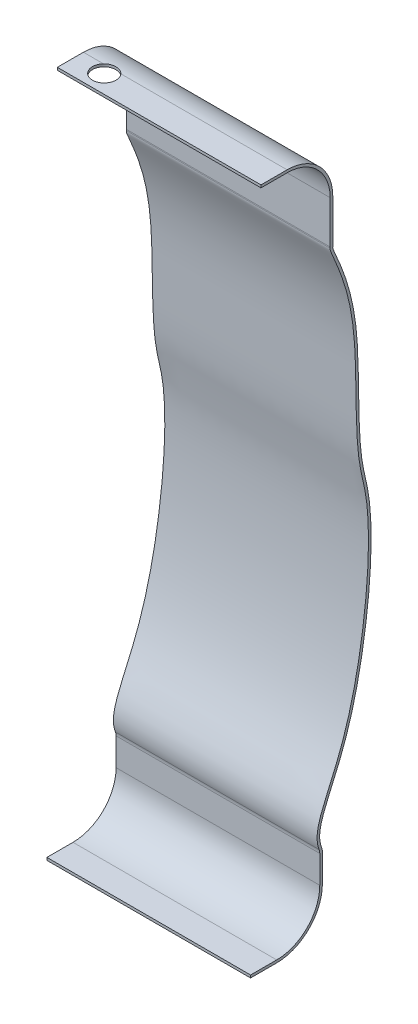
ISO-10303-21;
HEADER;
FILE_DESCRIPTION(('STEP AP214'),'2;1');
FILE_NAME('part.step','',(''),(''),'','','');
FILE_SCHEMA(('AUTOMOTIVE_DESIGN { 1 0 10303 214 1 1 1 1 }'));
ENDSEC;
DATA;
#1=APPLICATION_CONTEXT('core data for automotive mechanical design processes');
#2=APPLICATION_PROTOCOL_DEFINITION('international standard','automotive_design',2000,#1);
#3=PRODUCT_CONTEXT('',#1,'mechanical');
#4=PRODUCT('Part','Part','',(#3));
#5=PRODUCT_RELATED_PRODUCT_CATEGORY('part','',(#4));
#6=PRODUCT_DEFINITION_FORMATION('','',#4);
#7=PRODUCT_DEFINITION_CONTEXT('part definition',#1,'design');
#8=PRODUCT_DEFINITION('design','',#6,#7);
#9=PRODUCT_DEFINITION_SHAPE('','',#8);
#10=(LENGTH_UNIT() NAMED_UNIT(*) SI_UNIT(.MILLI.,.METRE.));
#11=(NAMED_UNIT(*) PLANE_ANGLE_UNIT() SI_UNIT($,.RADIAN.));
#12=(NAMED_UNIT(*) SI_UNIT($,.STERADIAN.) SOLID_ANGLE_UNIT());
#13=UNCERTAINTY_MEASURE_WITH_UNIT(LENGTH_MEASURE(1.E-05),#10,'distance_accuracy_value','');
#14=(GEOMETRIC_REPRESENTATION_CONTEXT(3) GLOBAL_UNCERTAINTY_ASSIGNED_CONTEXT((#13)) GLOBAL_UNIT_ASSIGNED_CONTEXT((#10,
#11,#12)) REPRESENTATION_CONTEXT('',''));
#15=CARTESIAN_POINT('',(0.,0.,0.));
#16=DIRECTION('',(0.,0.,1.));
#17=DIRECTION('',(1.,0.,0.));
#18=AXIS2_PLACEMENT_3D('',#15,#16,#17);
#19=CARTESIAN_POINT('',(15.6,52.21,-0.797662791309079));
#20=DIRECTION('',(0.,0.,-1.));
#21=DIRECTION('',(-1.,0.,0.));
#22=AXIS2_PLACEMENT_3D('',#19,#20,#21);
#23=PLANE('',#22);
#24=DIRECTION('',(0.,-1.,0.));
#25=VECTOR('',#24,1.);
#26=CARTESIAN_POINT('',(0.,52.21,-0.797662791309079));
#27=LINE('',#26,#25);
#28=CARTESIAN_POINT('',(0.,52.21,-0.797662791309079));
#29=VERTEX_POINT('',#28);
#30=CARTESIAN_POINT('',(0.,52.01,-0.797662791309079));
#31=VERTEX_POINT('',#30);
#32=EDGE_CURVE('E192',#29,#31,#27,.T.);
#33=ORIENTED_EDGE('',*,*,#32,.T.);
#34=DIRECTION('',(-1.,0.,0.));
#35=VECTOR('',#34,1.);
#36=CARTESIAN_POINT('',(15.6,52.01,-0.797662791309079));
#37=LINE('',#36,#35);
#38=CARTESIAN_POINT('',(15.6,52.01,-0.797662791309079));
#39=VERTEX_POINT('',#38);
#40=EDGE_CURVE('E49',#39,#31,#37,.T.);
#41=ORIENTED_EDGE('',*,*,#40,.F.);
#42=DIRECTION('',(0.,-1.,0.));
#43=VECTOR('',#42,1.);
#44=CARTESIAN_POINT('',(15.6,52.21,-0.797662791309079));
#45=LINE('',#44,#43);
#46=CARTESIAN_POINT('',(15.6,52.21,-0.797662791309079));
#47=VERTEX_POINT('',#46);
#48=EDGE_CURVE('E328',#47,#39,#45,.T.);
#49=ORIENTED_EDGE('',*,*,#48,.F.);
#50=DIRECTION('',(-1.,0.,0.));
#51=VECTOR('',#50,1.);
#52=CARTESIAN_POINT('',(15.6,52.21,-0.797662791309079));
#53=LINE('',#52,#51);
#54=EDGE_CURVE('E206',#47,#29,#53,.T.);
#55=ORIENTED_EDGE('',*,*,#54,.T.);
#56=EDGE_LOOP('',(#33,#41,#49,#55));
#57=FACE_BOUND('',#56,.T.);
#58=ADVANCED_FACE('F37',(#57),#23,.F.);
#59=CARTESIAN_POINT('',(15.6,52.01,-0.797662791309079));
#60=DIRECTION('',(0.,1.,0.));
#61=DIRECTION('',(0.,0.,1.));
#62=AXIS2_PLACEMENT_3D('',#59,#60,#61);
#63=PLANE('',#62);
#64=DIRECTION('',(-1.,0.,0.));
#65=VECTOR('',#64,1.);
#66=CARTESIAN_POINT('',(15.6,52.01,-2.79766279130905));
#67=LINE('',#66,#65);
#68=CARTESIAN_POINT('',(1.53652251454682,52.01,-2.79766279130905));
#69=VERTEX_POINT('',#68);
#70=CARTESIAN_POINT('',(0.,52.01,-2.79766279130905));
#71=VERTEX_POINT('',#70);
#72=EDGE_CURVE('E260',#69,#71,#67,.T.);
#73=ORIENTED_EDGE('',*,*,#72,.F.);
#74=CARTESIAN_POINT('',(2.20093170969449,52.01,-2.1905710178487));
#75=DIRECTION('',(0.,1.,0.));
#76=DIRECTION('',(0.,0.,1.));
#77=AXIS2_PLACEMENT_3D('',#74,#75,#76);
#78=CIRCLE('',#77,0.9);
#79=CARTESIAN_POINT('',(2.86534090484215,52.01,-2.79766279130905));
#80=VERTEX_POINT('',#79);
#81=EDGE_CURVE('E62',#69,#80,#78,.T.);
#82=ORIENTED_EDGE('',*,*,#81,.T.);
#83=CARTESIAN_POINT('',(15.6,52.01,-2.79766279130905));
#84=VERTEX_POINT('',#83);
#85=EDGE_CURVE('E261',#84,#80,#67,.T.);
#86=ORIENTED_EDGE('',*,*,#85,.F.);
#87=DIRECTION('',(0.,0.,-1.));
#88=VECTOR('',#87,1.);
#89=CARTESIAN_POINT('',(15.6,52.01,-0.797662791309079));
#90=LINE('',#89,#88);
#91=EDGE_CURVE('E273',#39,#84,#90,.T.);
#92=ORIENTED_EDGE('',*,*,#91,.F.);
#93=ORIENTED_EDGE('',*,*,#40,.T.);
#94=DIRECTION('',(0.,0.,-1.));
#95=VECTOR('',#94,1.);
#96=CARTESIAN_POINT('',(0.,52.01,-0.797662791309079));
#97=LINE('',#96,#95);
#98=EDGE_CURVE('E270',#31,#71,#97,.T.);
#99=ORIENTED_EDGE('',*,*,#98,.T.);
#100=EDGE_LOOP('',(#73,#82,#86,#92,#93,#99));
#101=FACE_BOUND('',#100,.T.);
#102=ADVANCED_FACE('F269',(#101),#63,.F.);
#103=CARTESIAN_POINT('',(15.6,48.71,-2.79766279130905));
#104=DIRECTION('',(-1.,0.,0.));
#105=DIRECTION('',(0.,0.,1.));
#106=AXIS2_PLACEMENT_3D('',#103,#104,#105);
#107=CYLINDRICAL_SURFACE('',#106,3.3);
#108=ORIENTED_EDGE('',*,*,#85,.T.);
#109=CARTESIAN_POINT('',(2.86534090484215,52.01,-2.79766279130905));
#110=CARTESIAN_POINT('',(2.83125262608083,52.0099950765936,-2.83503150673299));
#111=CARTESIAN_POINT('',(2.79397210331333,52.0093638458642,-2.86945221485938));
#112=CARTESIAN_POINT('',(2.71422797964797,52.0074304321461,-2.93155573770363));
#113=CARTESIAN_POINT('',(2.67176861601361,52.0061287949026,-2.95924400602279));
#114=CARTESIAN_POINT('',(2.58279534583216,52.0034339209938,-3.00711151326022));
#115=CARTESIAN_POINT('',(2.53628019799037,52.0020406563178,-3.02728844326601));
#116=CARTESIAN_POINT('',(2.44052467787826,51.9996310902168,-3.05956233725572));
#117=CARTESIAN_POINT('',(2.39128472689128,51.9986147307045,-3.07166054653652));
#118=CARTESIAN_POINT('',(2.29140700306978,51.9972622534174,-3.08743971806711));
#119=CARTESIAN_POINT('',(2.24076772748923,51.9969268982329,-3.0911112446963));
#120=CARTESIAN_POINT('',(2.1395902325073,51.9970345854965,-3.08990231841957));
#121=CARTESIAN_POINT('',(2.08905201667008,51.9974776549294,-3.08502156903995));
#122=CARTESIAN_POINT('',(1.98969159724615,51.9990124295294,-3.06688121259066));
#123=CARTESIAN_POINT('',(1.94086418648515,52.0001019446289,-3.05364988651291));
#124=CARTESIAN_POINT('',(1.84611336286375,52.0025995731614,-3.01921179700735));
#125=CARTESIAN_POINT('',(1.80018996055565,52.004007687752,-2.99800500460098));
#126=CARTESIAN_POINT('',(1.71545103251504,52.0065703466854,-2.94986017713211));
#127=CARTESIAN_POINT('',(1.67636612980037,52.0077355124315,-2.92339525646558));
#128=CARTESIAN_POINT('',(1.60277501931088,52.0094489592646,-2.86469194922545));
#129=CARTESIAN_POINT('',(1.56826998637905,52.0099970823347,-2.83245208620909));
#130=CARTESIAN_POINT('',(1.53652251454682,52.01,-2.79766279130905));
#131=B_SPLINE_CURVE_WITH_KNOTS('',3,(#109,#110,#111,#112,#113,#114,#115,#116,#117,#118,#119,
#120,#121,#122,#123,#124,#125,#126,#127,#128,#129,#130),.UNSPECIFIED.,.F.,.F.,(4,2,2,2,2,2,2,2,
2,2,4),(0.,0.151524297772248,0.302925441552756,0.454373086222092,0.605797380555743,
0.757391146868687,0.908990168443901,1.0600785029621,1.21116738645936,1.35224058869955,
1.49334990984048),.UNSPECIFIED.);
#132=EDGE_CURVE('E11',#80,#69,#131,.T.);
#133=ORIENTED_EDGE('',*,*,#132,.T.);
#134=ORIENTED_EDGE('',*,*,#72,.T.);
#135=CARTESIAN_POINT('',(0.,48.71,-2.79766279130905));
#136=DIRECTION('',(-1.,0.,0.));
#137=DIRECTION('',(0.,0.,1.));
#138=AXIS2_PLACEMENT_3D('',#135,#136,#137);
#139=CIRCLE('',#138,3.3);
#140=CARTESIAN_POINT('',(0.,48.71,-6.09766279130905));
#141=VERTEX_POINT('',#140);
#142=EDGE_CURVE('E281',#71,#141,#139,.T.);
#143=ORIENTED_EDGE('',*,*,#142,.T.);
#144=DIRECTION('',(-1.,0.,0.));
#145=VECTOR('',#144,1.);
#146=CARTESIAN_POINT('',(15.6,48.71,-6.09766279130905));
#147=LINE('',#146,#145);
#148=CARTESIAN_POINT('',(15.6,48.71,-6.09766279130905));
#149=VERTEX_POINT('',#148);
#150=EDGE_CURVE('E257',#149,#141,#147,.T.);
#151=ORIENTED_EDGE('',*,*,#150,.F.);
#152=CARTESIAN_POINT('',(15.6,48.71,-2.79766279130905));
#153=DIRECTION('',(-1.,0.,0.));
#154=DIRECTION('',(0.,0.,1.));
#155=AXIS2_PLACEMENT_3D('',#152,#153,#154);
#156=CIRCLE('',#155,3.3);
#157=EDGE_CURVE('E331',#84,#149,#156,.T.);
#158=ORIENTED_EDGE('',*,*,#157,.F.);
#159=EDGE_LOOP('',(#108,#133,#134,#143,#151,#158));
#160=FACE_BOUND('',#159,.T.);
#161=ADVANCED_FACE('F368',(#160),#107,.F.);
#162=CARTESIAN_POINT('',(15.6,48.71,-6.09766279130905));
#163=DIRECTION('',(0.,0.,-1.));
#164=DIRECTION('',(0.,1.,0.));
#165=AXIS2_PLACEMENT_3D('',#162,#163,#164);
#166=PLANE('',#165);
#167=DIRECTION('',(0.,-1.,0.));
#168=VECTOR('',#167,1.);
#169=CARTESIAN_POINT('',(0.,48.71,-6.09766279130905));
#170=LINE('',#169,#168);
#171=CARTESIAN_POINT('',(0.,45.4405241872609,-6.09766279130905));
#172=VERTEX_POINT('',#171);
#173=EDGE_CURVE('E287',#141,#172,#170,.T.);
#174=ORIENTED_EDGE('',*,*,#173,.T.);
#175=DIRECTION('',(-1.,0.,0.));
#176=VECTOR('',#175,1.);
#177=CARTESIAN_POINT('',(15.6,45.4405241872609,-6.09766279130905));
#178=LINE('',#177,#176);
#179=CARTESIAN_POINT('',(15.6,45.4405241872609,-6.09766279130905));
#180=VERTEX_POINT('',#179);
#181=EDGE_CURVE('E254',#180,#172,#178,.T.);
#182=ORIENTED_EDGE('',*,*,#181,.F.);
#183=DIRECTION('',(0.,-1.,0.));
#184=VECTOR('',#183,1.);
#185=CARTESIAN_POINT('',(15.6,48.71,-6.09766279130905));
#186=LINE('',#185,#184);
#187=EDGE_CURVE('E340',#149,#180,#186,.T.);
#188=ORIENTED_EDGE('',*,*,#187,.F.);
#189=ORIENTED_EDGE('',*,*,#150,.T.);
#190=EDGE_LOOP('',(#174,#182,#188,#189));
#191=FACE_BOUND('',#190,.T.);
#192=ADVANCED_FACE('F365',(#191),#166,.F.);
#193=CARTESIAN_POINT('',(15.6,45.4405241872609,-5.29766279130905));
#194=DIRECTION('',(-1.,0.,0.));
#195=DIRECTION('',(0.,0.,1.));
#196=AXIS2_PLACEMENT_3D('',#193,#194,#195);
#197=CYLINDRICAL_SURFACE('',#196,0.8);
#198=CARTESIAN_POINT('',(0.,45.4405241872609,-5.29766279130905));
#199=DIRECTION('',(-1.,0.,0.));
#200=DIRECTION('',(0.,0.,1.));
#201=AXIS2_PLACEMENT_3D('',#198,#199,#200);
#202=CIRCLE('',#201,0.8);
#203=CARTESIAN_POINT('',(0.,45.3611419140997,-6.09371458278229));
#204=VERTEX_POINT('',#203);
#205=EDGE_CURVE('E289',#172,#204,#202,.T.);
#206=ORIENTED_EDGE('',*,*,#205,.T.);
#207=DIRECTION('',(-1.,0.,0.));
#208=VECTOR('',#207,1.);
#209=CARTESIAN_POINT('',(15.6,45.3611419140997,-6.09371458278229));
#210=LINE('',#209,#208);
#211=CARTESIAN_POINT('',(15.6,45.3611419140997,-6.09371458278229));
#212=VERTEX_POINT('',#211);
#213=EDGE_CURVE('E251',#212,#204,#210,.T.);
#214=ORIENTED_EDGE('',*,*,#213,.F.);
#215=CARTESIAN_POINT('',(15.6,45.4405241872609,-5.29766279130905));
#216=DIRECTION('',(-1.,0.,0.));
#217=DIRECTION('',(0.,0.,1.));
#218=AXIS2_PLACEMENT_3D('',#215,#216,#217);
#219=CIRCLE('',#218,0.8);
#220=EDGE_CURVE('E342',#180,#212,#219,.T.);
#221=ORIENTED_EDGE('',*,*,#220,.F.);
#222=ORIENTED_EDGE('',*,*,#181,.T.);
#223=EDGE_LOOP('',(#206,#214,#221,#222));
#224=FACE_BOUND('',#223,.T.);
#225=ADVANCED_FACE('F360',(#224),#197,.F.);
#226=CARTESIAN_POINT('',(15.6,45.3611419140997,-6.09371458278229));
#227=CARTESIAN_POINT('',(15.6,45.2494484681349,-6.08257651396206));
#228=CARTESIAN_POINT('',(15.6,45.0578383023964,-6.15290897803949));
#229=CARTESIAN_POINT('',(15.6,44.6173743254229,-6.33914806295061));
#230=CARTESIAN_POINT('',(15.6,43.986650028269,-6.61619348950636));
#231=CARTESIAN_POINT('',(15.6,42.8956535042626,-7.04556487800436));
#232=CARTESIAN_POINT('',(15.6,41.0742650409865,-7.62154121331735));
#233=CARTESIAN_POINT('',(15.6,38.145708791002,-8.02996995413004));
#234=CARTESIAN_POINT('',(15.6,35.2285125464616,-8.06222946536529));
#235=CARTESIAN_POINT('',(15.6,32.9352796727567,-8.10334710477954));
#236=CARTESIAN_POINT('',(15.6,31.3036408467564,-8.17825231289054));
#237=CARTESIAN_POINT('',(15.6,29.822307078761,-8.3405845822269));
#238=CARTESIAN_POINT('',(15.6,28.5924177483747,-8.63809295163507));
#239=CARTESIAN_POINT('',(15.6,27.3372437401525,-8.89132751248411));
#240=CARTESIAN_POINT('',(15.6,25.8339133345473,-9.01878693222068));
#241=CARTESIAN_POINT('',(15.6,24.1785712860967,-9.0450346855065));
#242=CARTESIAN_POINT('',(15.6,21.822326787492,-8.95220635953251));
#243=CARTESIAN_POINT('',(15.6,18.7363368687496,-8.62342437381633));
#244=CARTESIAN_POINT('',(15.6,15.1954631063846,-7.97121503666978));
#245=CARTESIAN_POINT('',(15.6,12.285584548639,-7.13625115468488));
#246=CARTESIAN_POINT('',(15.6,10.1304173010619,-6.24321833397184));
#247=CARTESIAN_POINT('',(15.6,7.93623449177324,-5.23249018662494));
#248=CARTESIAN_POINT('',(15.6,6.72088456212092,-4.9332230214535));
#249=CARTESIAN_POINT('',(15.6,5.89386005510706,-5.24774959983525));
#250=B_SPLINE_CURVE_WITH_KNOTS('',3,(#226,#227,#228,#229,#230,#231,#232,#233,#234,#235,#236,
#237,#238,#239,#240,#241,#242,#243,#244,#245,#246,#247,#248,#249),.UNSPECIFIED.,.F.,.F.,(4,1,1,
1,1,1,1,1,1,1,1,1,1,1,1,1,1,1,1,1,1,4),(0.006984382045256,0.037839749250481,0.068695116455706,
0.099550483660931,0.130405850866156,0.192116585276606,0.253827319687056,0.315538054097506,
0.346393421302731,0.377248788507956,0.408104155713181,0.438959522918406,0.469814890123631,
0.500670257328856,0.531525624534081,0.562380991739306,0.624091726149756,0.685802460560206,
0.747513194970656,0.809223929381106,0.870934663791556,0.994356132612456),.UNSPECIFIED.);
#251=DIRECTION('',(-1.,0.,0.));
#252=VECTOR('',#251,1.);
#253=SURFACE_OF_LINEAR_EXTRUSION('',#250,#252);
#254=CARTESIAN_POINT('',(0.,45.3611419140997,-6.09371458278229));
#255=CARTESIAN_POINT('',(0.,45.2494484681349,-6.08257651396206));
#256=CARTESIAN_POINT('',(0.,45.0578383023964,-6.15290897803949));
#257=CARTESIAN_POINT('',(0.,44.6173743254229,-6.33914806295061));
#258=CARTESIAN_POINT('',(0.,43.986650028269,-6.61619348950636));
#259=CARTESIAN_POINT('',(0.,42.8956535042626,-7.04556487800436));
#260=CARTESIAN_POINT('',(0.,41.0742650409865,-7.62154121331735));
#261=CARTESIAN_POINT('',(0.,38.145708791002,-8.02996995413004));
#262=CARTESIAN_POINT('',(0.,35.2285125464616,-8.06222946536529));
#263=CARTESIAN_POINT('',(0.,32.9352796727567,-8.10334710477954));
#264=CARTESIAN_POINT('',(0.,31.3036408467564,-8.17825231289054));
#265=CARTESIAN_POINT('',(0.,29.822307078761,-8.3405845822269));
#266=CARTESIAN_POINT('',(0.,28.5924177483747,-8.63809295163507));
#267=CARTESIAN_POINT('',(0.,27.3372437401525,-8.89132751248411));
#268=CARTESIAN_POINT('',(0.,25.8339133345473,-9.01878693222068));
#269=CARTESIAN_POINT('',(0.,24.1785712860967,-9.0450346855065));
#270=CARTESIAN_POINT('',(0.,21.822326787492,-8.95220635953251));
#271=CARTESIAN_POINT('',(0.,18.7363368687496,-8.62342437381633));
#272=CARTESIAN_POINT('',(0.,15.1954631063846,-7.97121503666978));
#273=CARTESIAN_POINT('',(0.,12.285584548639,-7.13625115468488));
#274=CARTESIAN_POINT('',(0.,10.1304173010619,-6.24321833397184));
#275=CARTESIAN_POINT('',(0.,7.93623449177324,-5.23249018662494));
#276=CARTESIAN_POINT('',(0.,6.72088456212092,-4.9332230214535));
#277=CARTESIAN_POINT('',(0.,5.89386005510706,-5.24774959983525));
#278=B_SPLINE_CURVE_WITH_KNOTS('',3,(#254,#255,#256,#257,#258,#259,#260,#261,#262,#263,#264,
#265,#266,#267,#268,#269,#270,#271,#272,#273,#274,#275,#276,#277),.UNSPECIFIED.,.F.,.F.,(4,1,1,
1,1,1,1,1,1,1,1,1,1,1,1,1,1,1,1,1,1,4),(0.006984382045256,0.037839749250481,0.068695116455706,
0.099550483660931,0.130405850866156,0.192116585276606,0.253827319687056,0.315538054097506,
0.346393421302731,0.377248788507956,0.408104155713181,0.438959522918406,0.469814890123631,
0.500670257328856,0.531525624534081,0.562380991739306,0.624091726149756,0.685802460560206,
0.747513194970656,0.809223929381106,0.870934663791556,0.994356132612456),.UNSPECIFIED.);
#279=CARTESIAN_POINT('',(0.,5.89386005510706,-5.24774959983524));
#280=VERTEX_POINT('',#279);
#281=EDGE_CURVE('E291',#204,#280,#278,.T.);
#282=ORIENTED_EDGE('',*,*,#281,.T.);
#283=DIRECTION('',(-1.,0.,0.));
#284=VECTOR('',#283,1.);
#285=CARTESIAN_POINT('',(15.6,5.89386005510706,-5.24774959983524));
#286=LINE('',#285,#284);
#287=CARTESIAN_POINT('',(15.6,5.89386005510706,-5.24774959983524));
#288=VERTEX_POINT('',#287);
#289=EDGE_CURVE('E248',#288,#280,#286,.T.);
#290=ORIENTED_EDGE('',*,*,#289,.F.);
#291=EDGE_CURVE('E344',#212,#288,#250,.T.);
#292=ORIENTED_EDGE('',*,*,#291,.F.);
#293=ORIENTED_EDGE('',*,*,#213,.T.);
#294=EDGE_LOOP('',(#282,#290,#292,#293));
#295=FACE_BOUND('',#294,.T.);
#296=ADVANCED_FACE('F355',(#295),#253,.F.);
#297=CARTESIAN_POINT('',(15.6,5.60948260180559,-4.5));
#298=DIRECTION('',(-1.,0.,0.));
#299=DIRECTION('',(0.,0.,1.));
#300=AXIS2_PLACEMENT_3D('',#297,#298,#299);
#301=CYLINDRICAL_SURFACE('',#300,0.800000000000001);
#302=CARTESIAN_POINT('',(0.,5.60948260180559,-4.5));
#303=DIRECTION('',(-1.,0.,0.));
#304=DIRECTION('',(0.,0.,-1.));
#305=AXIS2_PLACEMENT_3D('',#302,#303,#304);
#306=CIRCLE('',#305,0.800000000000001);
#307=CARTESIAN_POINT('',(0.,5.60948260180559,-5.3));
#308=VERTEX_POINT('',#307);
#309=EDGE_CURVE('E295',#280,#308,#306,.T.);
#310=ORIENTED_EDGE('',*,*,#309,.T.);
#311=DIRECTION('',(-1.,0.,0.));
#312=VECTOR('',#311,1.);
#313=CARTESIAN_POINT('',(15.6,5.60948260180559,-5.3));
#314=LINE('',#313,#312);
#315=CARTESIAN_POINT('',(15.6,5.60948260180559,-5.3));
#316=VERTEX_POINT('',#315);
#317=EDGE_CURVE('E245',#316,#308,#314,.T.);
#318=ORIENTED_EDGE('',*,*,#317,.F.);
#319=CARTESIAN_POINT('',(15.6,5.60948260180559,-4.5));
#320=DIRECTION('',(-1.,0.,0.));
#321=DIRECTION('',(0.,0.,-1.));
#322=AXIS2_PLACEMENT_3D('',#319,#320,#321);
#323=CIRCLE('',#322,0.800000000000001);
#324=EDGE_CURVE('E349',#288,#316,#323,.T.);
#325=ORIENTED_EDGE('',*,*,#324,.F.);
#326=ORIENTED_EDGE('',*,*,#289,.T.);
#327=EDGE_LOOP('',(#310,#318,#325,#326));
#328=FACE_BOUND('',#327,.T.);
#329=ADVANCED_FACE('F359',(#328),#301,.F.);
#330=CARTESIAN_POINT('',(15.6,3.5,-5.3));
#331=DIRECTION('',(0.,0.,-1.));
#332=DIRECTION('',(0.,1.,0.));
#333=AXIS2_PLACEMENT_3D('',#330,#331,#332);
#334=PLANE('',#333);
#335=DIRECTION('',(0.,-1.,0.));
#336=VECTOR('',#335,1.);
#337=CARTESIAN_POINT('',(0.,3.5,-5.3));
#338=LINE('',#337,#336);
#339=CARTESIAN_POINT('',(0.,3.5,-5.3));
#340=VERTEX_POINT('',#339);
#341=EDGE_CURVE('E300',#308,#340,#338,.T.);
#342=ORIENTED_EDGE('',*,*,#341,.T.);
#343=DIRECTION('',(-1.,0.,0.));
#344=VECTOR('',#343,1.);
#345=CARTESIAN_POINT('',(15.6,3.5,-5.3));
#346=LINE('',#345,#344);
#347=CARTESIAN_POINT('',(15.6,3.5,-5.3));
#348=VERTEX_POINT('',#347);
#349=EDGE_CURVE('E242',#348,#340,#346,.T.);
#350=ORIENTED_EDGE('',*,*,#349,.F.);
#351=DIRECTION('',(0.,-1.,0.));
#352=VECTOR('',#351,1.);
#353=CARTESIAN_POINT('',(15.6,3.5,-5.3));
#354=LINE('',#353,#352);
#355=EDGE_CURVE('E628',#316,#348,#354,.T.);
#356=ORIENTED_EDGE('',*,*,#355,.F.);
#357=ORIENTED_EDGE('',*,*,#317,.T.);
#358=EDGE_LOOP('',(#342,#350,#356,#357));
#359=FACE_BOUND('',#358,.T.);
#360=ADVANCED_FACE('F408',(#359),#334,.F.);
#361=CARTESIAN_POINT('',(15.6,3.5,-2.));
#362=DIRECTION('',(-1.,0.,0.));
#363=DIRECTION('',(0.,0.,1.));
#364=AXIS2_PLACEMENT_3D('',#361,#362,#363);
#365=CYLINDRICAL_SURFACE('',#364,3.3);
#366=CARTESIAN_POINT('',(0.,3.5,-2.));
#367=DIRECTION('',(-1.,0.,0.));
#368=DIRECTION('',(0.,0.,1.));
#369=AXIS2_PLACEMENT_3D('',#366,#367,#368);
#370=CIRCLE('',#369,3.3);
#371=CARTESIAN_POINT('',(0.,0.199999999999999,-2.));
#372=VERTEX_POINT('',#371);
#373=EDGE_CURVE('E302',#340,#372,#370,.T.);
#374=ORIENTED_EDGE('',*,*,#373,.T.);
#375=DIRECTION('',(-1.,0.,0.));
#376=VECTOR('',#375,1.);
#377=CARTESIAN_POINT('',(15.6,0.199999999999999,-2.));
#378=LINE('',#377,#376);
#379=CARTESIAN_POINT('',(15.6,0.199999999999999,-2.));
#380=VERTEX_POINT('',#379);
#381=EDGE_CURVE('E239',#380,#372,#378,.T.);
#382=ORIENTED_EDGE('',*,*,#381,.F.);
#383=CARTESIAN_POINT('',(15.6,3.5,-2.));
#384=DIRECTION('',(-1.,0.,0.));
#385=DIRECTION('',(0.,0.,1.));
#386=AXIS2_PLACEMENT_3D('',#383,#384,#385);
#387=CIRCLE('',#386,3.3);
#388=EDGE_CURVE('E626',#348,#380,#387,.T.);
#389=ORIENTED_EDGE('',*,*,#388,.F.);
#390=ORIENTED_EDGE('',*,*,#349,.T.);
#391=EDGE_LOOP('',(#374,#382,#389,#390));
#392=FACE_BOUND('',#391,.T.);
#393=ADVANCED_FACE('F417',(#392),#365,.F.);
#394=CARTESIAN_POINT('',(15.6,0.199999999999999,-2.));
#395=DIRECTION('',(0.,-1.,0.));
#396=DIRECTION('',(0.,0.,-1.));
#397=AXIS2_PLACEMENT_3D('',#394,#395,#396);
#398=PLANE('',#397);
#399=DIRECTION('',(0.,0.,1.));
#400=VECTOR('',#399,1.);
#401=CARTESIAN_POINT('',(0.,0.199999999999999,-2.));
#402=LINE('',#401,#400);
#403=CARTESIAN_POINT('',(0.,0.199999999999999,0.));
#404=VERTEX_POINT('',#403);
#405=EDGE_CURVE('E304',#372,#404,#402,.T.);
#406=ORIENTED_EDGE('',*,*,#405,.T.);
#407=DIRECTION('',(-1.,0.,0.));
#408=VECTOR('',#407,1.);
#409=CARTESIAN_POINT('',(15.6,0.199999999999999,0.));
#410=LINE('',#409,#408);
#411=CARTESIAN_POINT('',(15.6,0.199999999999999,0.));
#412=VERTEX_POINT('',#411);
#413=EDGE_CURVE('E236',#412,#404,#410,.T.);
#414=ORIENTED_EDGE('',*,*,#413,.F.);
#415=DIRECTION('',(0.,0.,1.));
#416=VECTOR('',#415,1.);
#417=CARTESIAN_POINT('',(15.6,0.199999999999999,-2.));
#418=LINE('',#417,#416);
#419=EDGE_CURVE('E619',#380,#412,#418,.T.);
#420=ORIENTED_EDGE('',*,*,#419,.F.);
#421=ORIENTED_EDGE('',*,*,#381,.T.);
#422=EDGE_LOOP('',(#406,#414,#420,#421));
#423=FACE_BOUND('',#422,.T.);
#424=ADVANCED_FACE('F426',(#423),#398,.F.);
#425=CARTESIAN_POINT('',(15.6,0.199999999999999,0.));
#426=DIRECTION('',(0.,0.,-1.));
#427=DIRECTION('',(-1.,0.,0.));
#428=AXIS2_PLACEMENT_3D('',#425,#426,#427);
#429=PLANE('',#428);
#430=DIRECTION('',(0.,-1.,0.));
#431=VECTOR('',#430,1.);
#432=CARTESIAN_POINT('',(0.,0.199999999999999,0.));
#433=LINE('',#432,#431);
#434=CARTESIAN_POINT('',(0.,0.,0.));
#435=VERTEX_POINT('',#434);
#436=EDGE_CURVE('E306',#404,#435,#433,.T.);
#437=ORIENTED_EDGE('',*,*,#436,.T.);
#438=DIRECTION('',(-1.,0.,0.));
#439=VECTOR('',#438,1.);
#440=CARTESIAN_POINT('',(15.6,0.,0.));
#441=LINE('',#440,#439);
#442=CARTESIAN_POINT('',(15.6,0.,0.));
#443=VERTEX_POINT('',#442);
#444=EDGE_CURVE('E233',#443,#435,#441,.T.);
#445=ORIENTED_EDGE('',*,*,#444,.F.);
#446=DIRECTION('',(0.,-1.,0.));
#447=VECTOR('',#446,1.);
#448=CARTESIAN_POINT('',(15.6,0.199999999999999,0.));
#449=LINE('',#448,#447);
#450=EDGE_CURVE('E616',#412,#443,#449,.T.);
#451=ORIENTED_EDGE('',*,*,#450,.F.);
#452=ORIENTED_EDGE('',*,*,#413,.T.);
#453=EDGE_LOOP('',(#437,#445,#451,#452));
#454=FACE_BOUND('',#453,.T.);
#455=ADVANCED_FACE('F436',(#454),#429,.F.);
#456=CARTESIAN_POINT('',(15.6,0.,-2.));
#457=DIRECTION('',(0.,1.,0.));
#458=DIRECTION('',(0.,0.,1.));
#459=AXIS2_PLACEMENT_3D('',#456,#457,#458);
#460=PLANE('',#459);
#461=DIRECTION('',(0.,0.,-1.));
#462=VECTOR('',#461,1.);
#463=CARTESIAN_POINT('',(0.,0.,-2.));
#464=LINE('',#463,#462);
#465=CARTESIAN_POINT('',(0.,0.,-2.));
#466=VERTEX_POINT('',#465);
#467=EDGE_CURVE('E308',#435,#466,#464,.T.);
#468=ORIENTED_EDGE('',*,*,#467,.T.);
#469=DIRECTION('',(-1.,0.,0.));
#470=VECTOR('',#469,1.);
#471=CARTESIAN_POINT('',(15.6,0.,-2.));
#472=LINE('',#471,#470);
#473=CARTESIAN_POINT('',(15.6,0.,-2.));
#474=VERTEX_POINT('',#473);
#475=EDGE_CURVE('E230',#474,#466,#472,.T.);
#476=ORIENTED_EDGE('',*,*,#475,.F.);
#477=DIRECTION('',(0.,0.,-1.));
#478=VECTOR('',#477,1.);
#479=CARTESIAN_POINT('',(15.6,0.,-2.));
#480=LINE('',#479,#478);
#481=EDGE_CURVE('E614',#443,#474,#480,.T.);
#482=ORIENTED_EDGE('',*,*,#481,.F.);
#483=ORIENTED_EDGE('',*,*,#444,.T.);
#484=EDGE_LOOP('',(#468,#476,#482,#483));
#485=FACE_BOUND('',#484,.T.);
#486=ADVANCED_FACE('F446',(#485),#460,.F.);
#487=CARTESIAN_POINT('',(15.6,3.5,-2.));
#488=DIRECTION('',(-1.,0.,0.));
#489=DIRECTION('',(0.,0.,1.));
#490=AXIS2_PLACEMENT_3D('',#487,#488,#489);
#491=CYLINDRICAL_SURFACE('',#490,3.5);
#492=CARTESIAN_POINT('',(0.,3.5,-2.));
#493=DIRECTION('',(1.,0.,0.));
#494=DIRECTION('',(0.,0.,1.));
#495=AXIS2_PLACEMENT_3D('',#492,#493,#494);
#496=CIRCLE('',#495,3.5);
#497=CARTESIAN_POINT('',(0.,3.5,-5.5));
#498=VERTEX_POINT('',#497);
#499=EDGE_CURVE('E310',#466,#498,#496,.T.);
#500=ORIENTED_EDGE('',*,*,#499,.T.);
#501=DIRECTION('',(-1.,0.,0.));
#502=VECTOR('',#501,1.);
#503=CARTESIAN_POINT('',(15.6,3.5,-5.5));
#504=LINE('',#503,#502);
#505=CARTESIAN_POINT('',(15.6,3.5,-5.5));
#506=VERTEX_POINT('',#505);
#507=EDGE_CURVE('E227',#506,#498,#504,.T.);
#508=ORIENTED_EDGE('',*,*,#507,.F.);
#509=CARTESIAN_POINT('',(15.6,3.5,-2.));
#510=DIRECTION('',(1.,0.,0.));
#511=DIRECTION('',(0.,0.,1.));
#512=AXIS2_PLACEMENT_3D('',#509,#510,#511);
#513=CIRCLE('',#512,3.5);
#514=EDGE_CURVE('E607',#474,#506,#513,.T.);
#515=ORIENTED_EDGE('',*,*,#514,.F.);
#516=ORIENTED_EDGE('',*,*,#475,.T.);
#517=EDGE_LOOP('',(#500,#508,#515,#516));
#518=FACE_BOUND('',#517,.T.);
#519=ADVANCED_FACE('F456',(#518),#491,.T.);
#520=CARTESIAN_POINT('',(15.6,3.5,-5.5));
#521=DIRECTION('',(0.,0.,1.));
#522=DIRECTION('',(1.,0.,0.));
#523=AXIS2_PLACEMENT_3D('',#520,#521,#522);
#524=PLANE('',#523);
#525=DIRECTION('',(0.,1.,0.));
#526=VECTOR('',#525,1.);
#527=CARTESIAN_POINT('',(0.,3.5,-5.5));
#528=LINE('',#527,#526);
#529=CARTESIAN_POINT('',(0.,5.60948260180559,-5.5));
#530=VERTEX_POINT('',#529);
#531=EDGE_CURVE('E312',#498,#530,#528,.T.);
#532=ORIENTED_EDGE('',*,*,#531,.T.);
#533=DIRECTION('',(-1.,0.,0.));
#534=VECTOR('',#533,1.);
#535=CARTESIAN_POINT('',(15.6,5.60948260180559,-5.5));
#536=LINE('',#535,#534);
#537=CARTESIAN_POINT('',(15.6,5.60948260180559,-5.5));
#538=VERTEX_POINT('',#537);
#539=EDGE_CURVE('E224',#538,#530,#536,.T.);
#540=ORIENTED_EDGE('',*,*,#539,.F.);
#541=DIRECTION('',(0.,1.,0.));
#542=VECTOR('',#541,1.);
#543=CARTESIAN_POINT('',(15.6,3.5,-5.5));
#544=LINE('',#543,#542);
#545=EDGE_CURVE('E604',#506,#538,#544,.T.);
#546=ORIENTED_EDGE('',*,*,#545,.F.);
#547=ORIENTED_EDGE('',*,*,#507,.T.);
#548=EDGE_LOOP('',(#532,#540,#546,#547));
#549=FACE_BOUND('',#548,.T.);
#550=ADVANCED_FACE('F466',(#549),#524,.F.);
#551=CARTESIAN_POINT('',(15.6,5.60948260180559,-4.5));
#552=DIRECTION('',(-1.,0.,0.));
#553=DIRECTION('',(0.,0.,1.));
#554=AXIS2_PLACEMENT_3D('',#551,#552,#553);
#555=CYLINDRICAL_SURFACE('',#554,1.);
#556=CARTESIAN_POINT('',(0.,5.60948260180559,-4.5));
#557=DIRECTION('',(1.,0.,0.));
#558=DIRECTION('',(0.,0.,-1.));
#559=AXIS2_PLACEMENT_3D('',#556,#557,#558);
#560=CIRCLE('',#559,1.);
#561=CARTESIAN_POINT('',(0.,5.96495441843243,-5.43468699979406));
#562=VERTEX_POINT('',#561);
#563=EDGE_CURVE('E314',#530,#562,#560,.T.);
#564=ORIENTED_EDGE('',*,*,#563,.T.);
#565=DIRECTION('',(-1.,0.,0.));
#566=VECTOR('',#565,1.);
#567=CARTESIAN_POINT('',(15.6,5.96495441843243,-5.43468699979406));
#568=LINE('',#567,#566);
#569=CARTESIAN_POINT('',(15.6,5.96495441843243,-5.43468699979406));
#570=VERTEX_POINT('',#569);
#571=EDGE_CURVE('E221',#570,#562,#568,.T.);
#572=ORIENTED_EDGE('',*,*,#571,.F.);
#573=CARTESIAN_POINT('',(15.6,5.60948260180559,-4.5));
#574=DIRECTION('',(1.,0.,0.));
#575=DIRECTION('',(0.,0.,-1.));
#576=AXIS2_PLACEMENT_3D('',#573,#574,#575);
#577=CIRCLE('',#576,1.);
#578=EDGE_CURVE('E579',#538,#570,#577,.T.);
#579=ORIENTED_EDGE('',*,*,#578,.F.);
#580=ORIENTED_EDGE('',*,*,#539,.T.);
#581=EDGE_LOOP('',(#564,#572,#579,#580));
#582=FACE_BOUND('',#581,.T.);
#583=ADVANCED_FACE('F476',(#582),#555,.T.);
#584=CARTESIAN_POINT('',(15.6,5.96495441843243,-5.43468699979406));
#585=CARTESIAN_POINT('',(15.6,7.65919365826836,-4.79034905509424));
#586=CARTESIAN_POINT('',(15.6,10.8569605651582,-8.06869407027503));
#587=CARTESIAN_POINT('',(15.6,25.3216114207595,-9.79598207917336));
#588=CARTESIAN_POINT('',(15.6,31.3477438973433,-8.05451106304272));
#589=CARTESIAN_POINT('',(15.6,41.1908333808168,-8.74549385749673));
#590=CARTESIAN_POINT('',(15.6,45.0091619276847,-6.25960709126683));
#591=CARTESIAN_POINT('',(15.6,45.3412963458094,-6.2927275306506));
#592=B_SPLINE_CURVE_WITH_KNOTS('',3,(#584,#585,#586,#587,#588,#589,#590,#591),.UNSPECIFIED.,.F.,
.F.,(4,1,1,1,1,4),(0.006984382045256,0.281756511879145,0.543685711902952,0.592452525088993,
0.769424643739557,0.994356132612456),.UNSPECIFIED.);
#593=DIRECTION('',(-1.,0.,0.));
#594=VECTOR('',#593,1.);
#595=SURFACE_OF_LINEAR_EXTRUSION('',#592,#594);
#596=CARTESIAN_POINT('',(0.,5.96495441843243,-5.43468699979406));
#597=CARTESIAN_POINT('',(0.,7.65919365826836,-4.79034905509424));
#598=CARTESIAN_POINT('',(0.,10.8569605651582,-8.06869407027503));
#599=CARTESIAN_POINT('',(0.,25.3216114207595,-9.79598207917336));
#600=CARTESIAN_POINT('',(0.,31.3477438973433,-8.05451106304272));
#601=CARTESIAN_POINT('',(0.,41.1908333808168,-8.74549385749673));
#602=CARTESIAN_POINT('',(0.,45.0091619276847,-6.25960709126683));
#603=CARTESIAN_POINT('',(0.,45.3412963458094,-6.2927275306506));
#604=B_SPLINE_CURVE_WITH_KNOTS('',3,(#596,#597,#598,#599,#600,#601,#602,#603),.UNSPECIFIED.,.F.,
.F.,(4,1,1,1,1,4),(0.006984382045256,0.281756511879145,0.543685711902952,0.592452525088993,
0.769424643739557,0.994356132612456),.UNSPECIFIED.);
#605=CARTESIAN_POINT('',(0.,45.3412963458094,-6.2927275306506));
#606=VERTEX_POINT('',#605);
#607=EDGE_CURVE('E316',#562,#606,#604,.T.);
#608=ORIENTED_EDGE('',*,*,#607,.T.);
#609=DIRECTION('',(-1.,0.,0.));
#610=VECTOR('',#609,1.);
#611=CARTESIAN_POINT('',(15.6,45.3412963458094,-6.2927275306506));
#612=LINE('',#611,#610);
#613=CARTESIAN_POINT('',(15.6,45.3412963458094,-6.2927275306506));
#614=VERTEX_POINT('',#613);
#615=EDGE_CURVE('E218',#614,#606,#612,.T.);
#616=ORIENTED_EDGE('',*,*,#615,.F.);
#617=EDGE_CURVE('E572',#570,#614,#592,.T.);
#618=ORIENTED_EDGE('',*,*,#617,.F.);
#619=ORIENTED_EDGE('',*,*,#571,.T.);
#620=EDGE_LOOP('',(#608,#616,#618,#619));
#621=FACE_BOUND('',#620,.T.);
#622=ADVANCED_FACE('F486',(#621),#595,.F.);
#623=CARTESIAN_POINT('',(15.6,45.4405241872609,-5.29766279130905));
#624=DIRECTION('',(-1.,0.,0.));
#625=DIRECTION('',(0.,0.,1.));
#626=AXIS2_PLACEMENT_3D('',#623,#624,#625);
#627=CYLINDRICAL_SURFACE('',#626,1.);
#628=CARTESIAN_POINT('',(0.,45.4405241872609,-5.29766279130905));
#629=DIRECTION('',(1.,0.,0.));
#630=DIRECTION('',(0.,0.,1.));
#631=AXIS2_PLACEMENT_3D('',#628,#629,#630);
#632=CIRCLE('',#631,1.);
#633=CARTESIAN_POINT('',(0.,45.4405241872609,-6.29766279130905));
#634=VERTEX_POINT('',#633);
#635=EDGE_CURVE('E320',#606,#634,#632,.T.);
#636=ORIENTED_EDGE('',*,*,#635,.T.);
#637=DIRECTION('',(-1.,0.,0.));
#638=VECTOR('',#637,1.);
#639=CARTESIAN_POINT('',(15.6,45.4405241872609,-6.29766279130905));
#640=LINE('',#639,#638);
#641=CARTESIAN_POINT('',(15.6,45.4405241872609,-6.29766279130905));
#642=VERTEX_POINT('',#641);
#643=EDGE_CURVE('E215',#642,#634,#640,.T.);
#644=ORIENTED_EDGE('',*,*,#643,.F.);
#645=CARTESIAN_POINT('',(15.6,45.4405241872609,-5.29766279130905));
#646=DIRECTION('',(1.,0.,0.));
#647=DIRECTION('',(0.,0.,1.));
#648=AXIS2_PLACEMENT_3D('',#645,#646,#647);
#649=CIRCLE('',#648,1.);
#650=EDGE_CURVE('E578',#614,#642,#649,.T.);
#651=ORIENTED_EDGE('',*,*,#650,.F.);
#652=ORIENTED_EDGE('',*,*,#615,.T.);
#653=EDGE_LOOP('',(#636,#644,#651,#652));
#654=FACE_BOUND('',#653,.T.);
#655=ADVANCED_FACE('F496',(#654),#627,.T.);
#656=CARTESIAN_POINT('',(15.6,48.71,-6.29766279130905));
#657=DIRECTION('',(0.,0.,1.));
#658=DIRECTION('',(1.,0.,0.));
#659=AXIS2_PLACEMENT_3D('',#656,#657,#658);
#660=PLANE('',#659);
#661=DIRECTION('',(0.,1.,0.));
#662=VECTOR('',#661,1.);
#663=CARTESIAN_POINT('',(0.,48.71,-6.29766279130905));
#664=LINE('',#663,#662);
#665=CARTESIAN_POINT('',(0.,48.71,-6.29766279130905));
#666=VERTEX_POINT('',#665);
#667=EDGE_CURVE('E325',#634,#666,#664,.T.);
#668=ORIENTED_EDGE('',*,*,#667,.T.);
#669=DIRECTION('',(-1.,0.,0.));
#670=VECTOR('',#669,1.);
#671=CARTESIAN_POINT('',(15.6,48.71,-6.29766279130905));
#672=LINE('',#671,#670);
#673=CARTESIAN_POINT('',(15.6,48.71,-6.29766279130905));
#674=VERTEX_POINT('',#673);
#675=EDGE_CURVE('E208',#674,#666,#672,.T.);
#676=ORIENTED_EDGE('',*,*,#675,.F.);
#677=DIRECTION('',(0.,1.,0.));
#678=VECTOR('',#677,1.);
#679=CARTESIAN_POINT('',(15.6,48.71,-6.29766279130905));
#680=LINE('',#679,#678);
#681=EDGE_CURVE('E585',#642,#674,#680,.T.);
#682=ORIENTED_EDGE('',*,*,#681,.F.);
#683=ORIENTED_EDGE('',*,*,#643,.T.);
#684=EDGE_LOOP('',(#668,#676,#682,#683));
#685=FACE_BOUND('',#684,.T.);
#686=ADVANCED_FACE('F506',(#685),#660,.F.);
#687=CARTESIAN_POINT('',(15.6,48.71,-2.79766279130905));
#688=DIRECTION('',(-1.,0.,0.));
#689=DIRECTION('',(0.,0.,1.));
#690=AXIS2_PLACEMENT_3D('',#687,#688,#689);
#691=CYLINDRICAL_SURFACE('',#690,3.5);
#692=DIRECTION('',(-1.,0.,0.));
#693=VECTOR('',#692,1.);
#694=CARTESIAN_POINT('',(15.6,52.21,-2.79766279130905));
#695=LINE('',#694,#693);
#696=CARTESIAN_POINT('',(1.53652251454682,52.21,-2.79766279130905));
#697=VERTEX_POINT('',#696);
#698=CARTESIAN_POINT('',(0.,52.21,-2.79766279130905));
#699=VERTEX_POINT('',#698);
#700=EDGE_CURVE('E196',#697,#699,#695,.T.);
#701=ORIENTED_EDGE('',*,*,#700,.F.);
#702=CARTESIAN_POINT('',(1.53652251454682,52.21,-2.79766279130905));
#703=CARTESIAN_POINT('',(1.57061463054689,52.2099953654535,-2.83503589173247));
#704=CARTESIAN_POINT('',(1.6079006585284,52.2094000407778,-2.8694609805461));
#705=CARTESIAN_POINT('',(1.68765813638456,52.2075767689952,-2.9315719358286));
#706=CARTESIAN_POINT('',(1.73012534283444,52.20634933697,-2.95926326239377));
#707=CARTESIAN_POINT('',(1.81911655185342,52.20380840417,-3.0071347587838));
#708=CARTESIAN_POINT('',(1.86564187164684,52.2024948754837,-3.02731247848242));
#709=CARTESIAN_POINT('',(1.9614171116798,52.2002236195251,-3.05958448123419));
#710=CARTESIAN_POINT('',(2.01066661837487,52.199265838418,-3.071679987579));
#711=CARTESIAN_POINT('',(2.11055579589123,52.1979918436767,-3.08744985159531));
#712=CARTESIAN_POINT('',(2.16119680576444,52.1976762716399,-3.09111578820081));
#713=CARTESIAN_POINT('',(2.26237689984819,52.1977787292894,-3.08989531592002));
#714=CARTESIAN_POINT('',(2.31291598041748,52.1981967847343,-3.08500860673971));
#715=CARTESIAN_POINT('',(2.41229693834354,52.1996444647538,-3.0668522444054));
#716=CARTESIAN_POINT('',(2.4611434436845,52.2006722547226,-3.05360773112865));
#717=CARTESIAN_POINT('',(2.55592921144145,52.2030281644315,-3.01913638433369));
#718=CARTESIAN_POINT('',(2.60186847121795,52.2043562844442,-2.99790954356848));
#719=CARTESIAN_POINT('',(2.68658040096933,52.2067712089321,-2.94975036665297));
#720=CARTESIAN_POINT('',(2.72562746970277,52.2078682486922,-2.92329955319867));
#721=CARTESIAN_POINT('',(2.79914849391506,52.2094813549175,-2.86463579538425));
#722=CARTESIAN_POINT('',(2.83362133069808,52.2099972794926,-2.83242144597356));
#723=CARTESIAN_POINT('',(2.86534090484215,52.21,-2.79766279130905));
#724=B_SPLINE_CURVE_WITH_KNOTS('',3,(#702,#703,#704,#705,#706,#707,#708,#709,#710,#711,#712,
#713,#714,#715,#716,#717,#718,#719,#720,#721,#722,#723),.UNSPECIFIED.,.F.,.F.,(4,2,2,2,2,2,2,2,
2,2,4),(0.,0.151543617984893,0.302963943426355,0.454433602656495,0.605880330845265,
0.757478287375491,0.90908156680525,1.06023099038001,1.21138055118059,1.35233303743425,
1.4933199324082),.UNSPECIFIED.);
#725=CARTESIAN_POINT('',(2.86534090484215,52.21,-2.79766279130905));
#726=VERTEX_POINT('',#725);
#727=EDGE_CURVE('E186',#697,#726,#724,.T.);
#728=ORIENTED_EDGE('',*,*,#727,.T.);
#729=CARTESIAN_POINT('',(15.6,52.21,-2.79766279130905));
#730=VERTEX_POINT('',#729);
#731=EDGE_CURVE('E199',#730,#726,#695,.T.);
#732=ORIENTED_EDGE('',*,*,#731,.F.);
#733=CARTESIAN_POINT('',(15.6,48.71,-2.79766279130905));
#734=DIRECTION('',(1.,0.,0.));
#735=DIRECTION('',(0.,0.,1.));
#736=AXIS2_PLACEMENT_3D('',#733,#734,#735);
#737=CIRCLE('',#736,3.5);
#738=EDGE_CURVE('E586',#674,#730,#737,.T.);
#739=ORIENTED_EDGE('',*,*,#738,.F.);
#740=ORIENTED_EDGE('',*,*,#675,.T.);
#741=CARTESIAN_POINT('',(0.,48.71,-2.79766279130905));
#742=DIRECTION('',(1.,0.,0.));
#743=DIRECTION('',(0.,0.,1.));
#744=AXIS2_PLACEMENT_3D('',#741,#742,#743);
#745=CIRCLE('',#744,3.5);
#746=EDGE_CURVE('E204',#666,#699,#745,.T.);
#747=ORIENTED_EDGE('',*,*,#746,.T.);
#748=EDGE_LOOP('',(#701,#728,#732,#739,#740,#747));
#749=FACE_BOUND('',#748,.T.);
#750=ADVANCED_FACE('F201',(#749),#691,.T.);
#751=CARTESIAN_POINT('',(15.6,52.21,-0.797662791309079));
#752=DIRECTION('',(0.,-1.,0.));
#753=DIRECTION('',(0.,0.,-1.));
#754=AXIS2_PLACEMENT_3D('',#751,#752,#753);
#755=PLANE('',#754);
#756=ORIENTED_EDGE('',*,*,#731,.T.);
#757=CARTESIAN_POINT('',(2.20093170969449,52.21,-2.1905710178487));
#758=DIRECTION('',(0.,1.,0.));
#759=DIRECTION('',(0.,0.,1.));
#760=AXIS2_PLACEMENT_3D('',#757,#758,#759);
#761=CIRCLE('',#760,0.9);
#762=EDGE_CURVE('E55',#697,#726,#761,.T.);
#763=ORIENTED_EDGE('',*,*,#762,.F.);
#764=ORIENTED_EDGE('',*,*,#700,.T.);
#765=DIRECTION('',(0.,0.,1.));
#766=VECTOR('',#765,1.);
#767=CARTESIAN_POINT('',(0.,52.21,-0.797662791309079));
#768=LINE('',#767,#766);
#769=EDGE_CURVE('E327',#699,#29,#768,.T.);
#770=ORIENTED_EDGE('',*,*,#769,.T.);
#771=ORIENTED_EDGE('',*,*,#54,.F.);
#772=DIRECTION('',(0.,0.,1.));
#773=VECTOR('',#772,1.);
#774=CARTESIAN_POINT('',(15.6,52.21,-0.797662791309079));
#775=LINE('',#774,#773);
#776=EDGE_CURVE('E210',#730,#47,#775,.T.);
#777=ORIENTED_EDGE('',*,*,#776,.F.);
#778=EDGE_LOOP('',(#756,#763,#764,#770,#771,#777));
#779=FACE_BOUND('',#778,.T.);
#780=ADVANCED_FACE('F195',(#779),#755,.F.);
#781=CARTESIAN_POINT('',(15.6,48.71,-2.79766279130905));
#782=DIRECTION('',(-1.,0.,0.));
#783=DIRECTION('',(0.,0.,1.));
#784=AXIS2_PLACEMENT_3D('',#781,#782,#783);
#785=PLANE('',#784);
#786=ORIENTED_EDGE('',*,*,#48,.T.);
#787=ORIENTED_EDGE('',*,*,#91,.T.);
#788=ORIENTED_EDGE('',*,*,#157,.T.);
#789=ORIENTED_EDGE('',*,*,#187,.T.);
#790=ORIENTED_EDGE('',*,*,#220,.T.);
#791=ORIENTED_EDGE('',*,*,#291,.T.);
#792=ORIENTED_EDGE('',*,*,#324,.T.);
#793=ORIENTED_EDGE('',*,*,#355,.T.);
#794=ORIENTED_EDGE('',*,*,#388,.T.);
#795=ORIENTED_EDGE('',*,*,#419,.T.);
#796=ORIENTED_EDGE('',*,*,#450,.T.);
#797=ORIENTED_EDGE('',*,*,#481,.T.);
#798=ORIENTED_EDGE('',*,*,#514,.T.);
#799=ORIENTED_EDGE('',*,*,#545,.T.);
#800=ORIENTED_EDGE('',*,*,#578,.T.);
#801=ORIENTED_EDGE('',*,*,#617,.T.);
#802=ORIENTED_EDGE('',*,*,#650,.T.);
#803=ORIENTED_EDGE('',*,*,#681,.T.);
#804=ORIENTED_EDGE('',*,*,#738,.T.);
#805=ORIENTED_EDGE('',*,*,#776,.T.);
#806=EDGE_LOOP('',(#786,#787,#788,#789,#790,#791,#792,#793,#794,#795,#796,#797,#798,#799,#800,
#801,#802,#803,#804,#805));
#807=FACE_BOUND('',#806,.T.);
#808=ADVANCED_FACE('F523',(#807),#785,.F.);
#809=CARTESIAN_POINT('',(0.,48.71,-2.79766279130905));
#810=DIRECTION('',(-1.,0.,0.));
#811=DIRECTION('',(0.,0.,1.));
#812=AXIS2_PLACEMENT_3D('',#809,#810,#811);
#813=PLANE('',#812);
#814=ORIENTED_EDGE('',*,*,#32,.F.);
#815=ORIENTED_EDGE('',*,*,#769,.F.);
#816=ORIENTED_EDGE('',*,*,#746,.F.);
#817=ORIENTED_EDGE('',*,*,#667,.F.);
#818=ORIENTED_EDGE('',*,*,#635,.F.);
#819=ORIENTED_EDGE('',*,*,#607,.F.);
#820=ORIENTED_EDGE('',*,*,#563,.F.);
#821=ORIENTED_EDGE('',*,*,#531,.F.);
#822=ORIENTED_EDGE('',*,*,#499,.F.);
#823=ORIENTED_EDGE('',*,*,#467,.F.);
#824=ORIENTED_EDGE('',*,*,#436,.F.);
#825=ORIENTED_EDGE('',*,*,#405,.F.);
#826=ORIENTED_EDGE('',*,*,#373,.F.);
#827=ORIENTED_EDGE('',*,*,#341,.F.);
#828=ORIENTED_EDGE('',*,*,#309,.F.);
#829=ORIENTED_EDGE('',*,*,#281,.F.);
#830=ORIENTED_EDGE('',*,*,#205,.F.);
#831=ORIENTED_EDGE('',*,*,#173,.F.);
#832=ORIENTED_EDGE('',*,*,#142,.F.);
#833=ORIENTED_EDGE('',*,*,#98,.F.);
#834=EDGE_LOOP('',(#814,#815,#816,#817,#818,#819,#820,#821,#822,#823,#824,#825,#826,#827,#828,
#829,#830,#831,#832,#833));
#835=FACE_BOUND('',#834,.T.);
#836=ADVANCED_FACE('F528',(#835),#813,.T.);
#837=CARTESIAN_POINT('',(2.20093170969449,52.21,-2.1905710178487));
#838=DIRECTION('',(0.,1.,0.));
#839=DIRECTION('',(0.,0.,1.));
#840=AXIS2_PLACEMENT_3D('',#837,#838,#839);
#841=CYLINDRICAL_SURFACE('',#840,0.9);
#842=ORIENTED_EDGE('',*,*,#132,.F.);
#843=ORIENTED_EDGE('',*,*,#81,.F.);
#844=EDGE_LOOP('',(#842,#843));
#845=FACE_BOUND('',#844,.T.);
#846=ORIENTED_EDGE('',*,*,#762,.T.);
#847=ORIENTED_EDGE('',*,*,#727,.F.);
#848=EDGE_LOOP('',(#846,#847));
#849=FACE_BOUND('',#848,.T.);
#850=ADVANCED_FACE('F187',(#845,#849),#841,.F.);
#851=CLOSED_SHELL('',(#58,#102,#161,#192,#225,#296,#329,#360,#393,#424,#455,#486,#519,#550,#583,
#622,#655,#686,#750,#780,#808,#836,#850));
#852=MANIFOLD_SOLID_BREP('B2',#851);
#853=ADVANCED_BREP_SHAPE_REPRESENTATION('',(#18,#852),#14);
#854=SHAPE_DEFINITION_REPRESENTATION(#9,#853);
ENDSEC;
END-ISO-10303-21;
